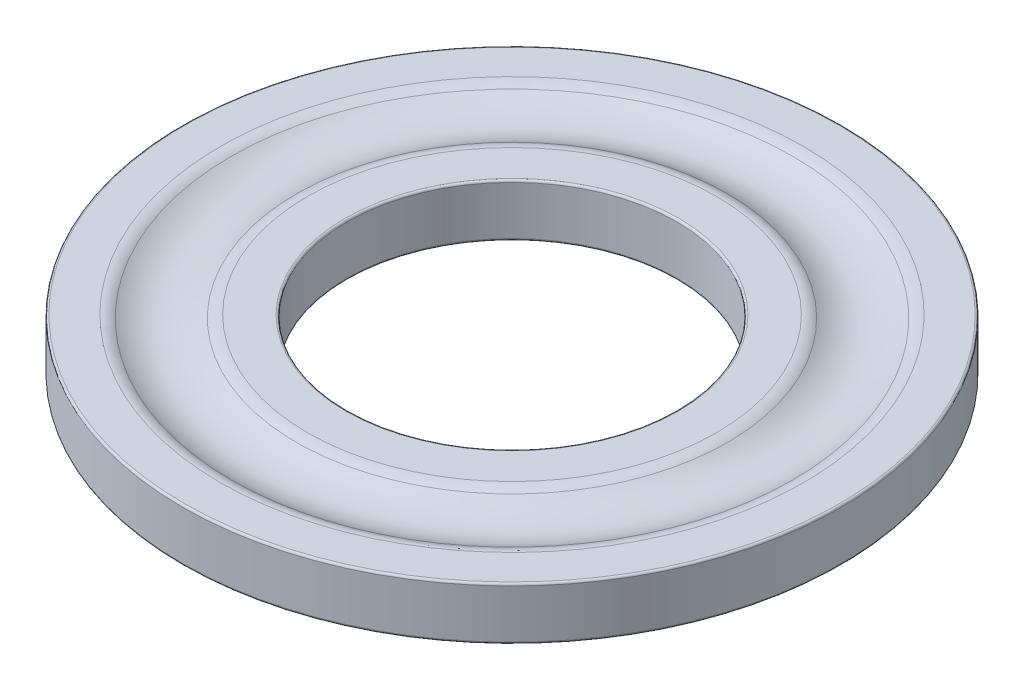
ISO-10303-21;
HEADER;
FILE_DESCRIPTION(('STEP AP214'),'2;1');
FILE_NAME('part.step','',(''),(''),'','','');
FILE_SCHEMA(('AUTOMOTIVE_DESIGN { 1 0 10303 214 1 1 1 1 }'));
ENDSEC;
DATA;
#1=APPLICATION_CONTEXT('core data for automotive mechanical design processes');
#2=APPLICATION_PROTOCOL_DEFINITION('international standard','automotive_design',2000,#1);
#3=PRODUCT_CONTEXT('',#1,'mechanical');
#4=PRODUCT('Part','Part','',(#3));
#5=PRODUCT_RELATED_PRODUCT_CATEGORY('part','',(#4));
#6=PRODUCT_DEFINITION_FORMATION('','',#4);
#7=PRODUCT_DEFINITION_CONTEXT('part definition',#1,'design');
#8=PRODUCT_DEFINITION('design','',#6,#7);
#9=PRODUCT_DEFINITION_SHAPE('','',#8);
#10=(LENGTH_UNIT() NAMED_UNIT(*) SI_UNIT(.MILLI.,.METRE.));
#11=(NAMED_UNIT(*) PLANE_ANGLE_UNIT() SI_UNIT($,.RADIAN.));
#12=(NAMED_UNIT(*) SI_UNIT($,.STERADIAN.) SOLID_ANGLE_UNIT());
#13=UNCERTAINTY_MEASURE_WITH_UNIT(LENGTH_MEASURE(1.E-05),#10,'distance_accuracy_value','');
#14=(GEOMETRIC_REPRESENTATION_CONTEXT(3) GLOBAL_UNCERTAINTY_ASSIGNED_CONTEXT((#13)) GLOBAL_UNIT_ASSIGNED_CONTEXT((#10,
#11,#12)) REPRESENTATION_CONTEXT('',''));
#15=CARTESIAN_POINT('',(0.,0.,0.));
#16=DIRECTION('',(0.,0.,1.));
#17=DIRECTION('',(1.,0.,0.));
#18=AXIS2_PLACEMENT_3D('',#15,#16,#17);
#19=CARTESIAN_POINT('',(0.,2.48,0.));
#20=DIRECTION('',(0.,-1.,0.));
#21=DIRECTION('',(0.,0.,-1.));
#22=AXIS2_PLACEMENT_3D('',#19,#20,#21);
#23=TOROIDAL_SURFACE('',#22,6.02,1.5);
#24=CARTESIAN_POINT('',(0.,1.205,0.));
#25=DIRECTION('',(0.,1.,0.));
#26=DIRECTION('',(0.,0.,1.));
#27=AXIS2_PLACEMENT_3D('',#24,#25,#26);
#28=CIRCLE('',#27,6.81017403146396);
#29=CARTESIAN_POINT('',(0.,1.205,6.81017403146395));
#30=VERTEX_POINT('',#29);
#31=EDGE_CURVE('E74',#30,#30,#28,.F.);
#32=ORIENTED_EDGE('',*,*,#31,.F.);
#33=EDGE_LOOP('',(#32));
#34=FACE_BOUND('',#33,.T.);
#35=CARTESIAN_POINT('',(0.,1.205,0.));
#36=DIRECTION('',(0.,-1.,0.));
#37=DIRECTION('',(0.,0.,-1.));
#38=AXIS2_PLACEMENT_3D('',#35,#36,#37);
#39=CIRCLE('',#38,5.22982596853604);
#40=CARTESIAN_POINT('',(0.,1.205,-5.22982596853604));
#41=VERTEX_POINT('',#40);
#42=EDGE_CURVE('E320',#41,#41,#39,.F.);
#43=ORIENTED_EDGE('',*,*,#42,.F.);
#44=EDGE_LOOP('',(#43));
#45=FACE_BOUND('',#44,.T.);
#46=ADVANCED_FACE('F17',(#34,#45),#23,.F.);
#47=CARTESIAN_POINT('',(0.,0.78,0.));
#48=DIRECTION('',(0.,-1.,0.));
#49=DIRECTION('',(0.,0.,-1.));
#50=AXIS2_PLACEMENT_3D('',#47,#48,#49);
#51=TOROIDAL_SURFACE('',#50,4.96643462471473,0.5);
#52=ORIENTED_EDGE('',*,*,#42,.T.);
#53=EDGE_LOOP('',(#52));
#54=FACE_BOUND('',#53,.T.);
#55=CARTESIAN_POINT('',(0.,1.28,0.));
#56=DIRECTION('',(0.,-1.,0.));
#57=DIRECTION('',(0.,0.,-1.));
#58=AXIS2_PLACEMENT_3D('',#55,#56,#57);
#59=CIRCLE('',#58,4.96643462471473);
#60=CARTESIAN_POINT('',(0.,1.28,4.96643462471473));
#61=VERTEX_POINT('',#60);
#62=CARTESIAN_POINT('',(0.,1.28,-4.96643462471473));
#63=VERTEX_POINT('',#62);
#64=EDGE_CURVE('E66',#61,#63,#59,.F.);
#65=ORIENTED_EDGE('',*,*,#64,.F.);
#66=CARTESIAN_POINT('',(0.,1.28,0.));
#67=DIRECTION('',(0.,-1.,0.));
#68=DIRECTION('',(0.,0.,1.));
#69=AXIS2_PLACEMENT_3D('',#66,#67,#68);
#70=CIRCLE('',#69,4.96643462471473);
#71=EDGE_CURVE('E69',#63,#61,#70,.F.);
#72=ORIENTED_EDGE('',*,*,#71,.F.);
#73=EDGE_LOOP('',(#65,#72));
#74=FACE_BOUND('',#73,.T.);
#75=ADVANCED_FACE('F78',(#54,#74),#51,.T.);
#76=CARTESIAN_POINT('',(0.,0.78,0.));
#77=DIRECTION('',(0.,1.,0.));
#78=DIRECTION('',(0.,0.,1.));
#79=AXIS2_PLACEMENT_3D('',#76,#77,#78);
#80=TOROIDAL_SURFACE('',#79,7.07356537528527,0.5);
#81=ORIENTED_EDGE('',*,*,#31,.T.);
#82=EDGE_LOOP('',(#81));
#83=FACE_BOUND('',#82,.T.);
#84=CARTESIAN_POINT('',(0.,1.28,0.));
#85=DIRECTION('',(0.,1.,0.));
#86=DIRECTION('',(0.,0.,1.));
#87=AXIS2_PLACEMENT_3D('',#84,#85,#86);
#88=CIRCLE('',#87,7.07356537528527);
#89=CARTESIAN_POINT('',(0.,1.28,-7.07356537528527));
#90=VERTEX_POINT('',#89);
#91=CARTESIAN_POINT('',(0.,1.28,7.07356537528527));
#92=VERTEX_POINT('',#91);
#93=EDGE_CURVE('E116',#90,#92,#88,.F.);
#94=ORIENTED_EDGE('',*,*,#93,.F.);
#95=CARTESIAN_POINT('',(0.,1.28,0.));
#96=DIRECTION('',(0.,1.,0.));
#97=DIRECTION('',(0.,0.,-1.));
#98=AXIS2_PLACEMENT_3D('',#95,#96,#97);
#99=CIRCLE('',#98,7.07356537528527);
#100=EDGE_CURVE('E79',#92,#90,#99,.F.);
#101=ORIENTED_EDGE('',*,*,#100,.F.);
#102=EDGE_LOOP('',(#94,#101));
#103=FACE_BOUND('',#102,.T.);
#104=ADVANCED_FACE('F95',(#83,#103),#80,.T.);
#105=CARTESIAN_POINT('',(0.,1.28,0.));
#106=DIRECTION('',(0.,1.,0.));
#107=DIRECTION('',(0.,0.,1.));
#108=AXIS2_PLACEMENT_3D('',#105,#106,#107);
#109=PLANE('',#108);
#110=ORIENTED_EDGE('',*,*,#71,.T.);
#111=ORIENTED_EDGE('',*,*,#64,.T.);
#112=EDGE_LOOP('',(#110,#111));
#113=FACE_BOUND('',#112,.T.);
#114=CARTESIAN_POINT('',(0.,1.28,0.));
#115=DIRECTION('',(0.,1.,0.));
#116=DIRECTION('',(0.,0.,-1.));
#117=AXIS2_PLACEMENT_3D('',#114,#115,#116);
#118=CIRCLE('',#117,4.05);
#119=CARTESIAN_POINT('',(0.,1.28,-4.05));
#120=VERTEX_POINT('',#119);
#121=CARTESIAN_POINT('',(0.,1.28,4.05));
#122=VERTEX_POINT('',#121);
#123=EDGE_CURVE('E127',#120,#122,#118,.T.);
#124=ORIENTED_EDGE('',*,*,#123,.F.);
#125=CARTESIAN_POINT('',(0.,1.28,0.));
#126=DIRECTION('',(0.,1.,0.));
#127=DIRECTION('',(0.,0.,1.));
#128=AXIS2_PLACEMENT_3D('',#125,#126,#127);
#129=CIRCLE('',#128,4.05);
#130=EDGE_CURVE('E128',#122,#120,#129,.T.);
#131=ORIENTED_EDGE('',*,*,#130,.F.);
#132=EDGE_LOOP('',(#124,#131));
#133=FACE_BOUND('',#132,.T.);
#134=ADVANCED_FACE('F71',(#113,#133),#109,.T.);
#135=CARTESIAN_POINT('',(0.,1.28,0.));
#136=DIRECTION('',(0.,1.,0.));
#137=DIRECTION('',(0.,0.,1.));
#138=AXIS2_PLACEMENT_3D('',#135,#136,#137);
#139=PLANE('',#138);
#140=ORIENTED_EDGE('',*,*,#100,.T.);
#141=ORIENTED_EDGE('',*,*,#93,.T.);
#142=EDGE_LOOP('',(#140,#141));
#143=FACE_BOUND('',#142,.T.);
#144=CARTESIAN_POINT('',(0.,1.28,0.));
#145=DIRECTION('',(0.,-1.,0.));
#146=DIRECTION('',(0.,0.,-1.));
#147=AXIS2_PLACEMENT_3D('',#144,#145,#146);
#148=CIRCLE('',#147,7.95);
#149=CARTESIAN_POINT('',(0.,1.28,-7.95));
#150=VERTEX_POINT('',#149);
#151=CARTESIAN_POINT('',(0.,1.28,7.95));
#152=VERTEX_POINT('',#151);
#153=EDGE_CURVE('E198',#150,#152,#148,.T.);
#154=ORIENTED_EDGE('',*,*,#153,.F.);
#155=CARTESIAN_POINT('',(0.,1.28,0.));
#156=DIRECTION('',(0.,-1.,0.));
#157=DIRECTION('',(0.,0.,1.));
#158=AXIS2_PLACEMENT_3D('',#155,#156,#157);
#159=CIRCLE('',#158,7.95);
#160=EDGE_CURVE('E170',#152,#150,#159,.T.);
#161=ORIENTED_EDGE('',*,*,#160,.F.);
#162=EDGE_LOOP('',(#154,#161));
#163=FACE_BOUND('',#162,.T.);
#164=ADVANCED_FACE('F130',(#143,#163),#139,.T.);
#165=CARTESIAN_POINT('',(0.,1.23,0.));
#166=DIRECTION('',(0.,1.,0.));
#167=DIRECTION('',(0.,0.,1.));
#168=AXIS2_PLACEMENT_3D('',#165,#166,#167);
#169=TOROIDAL_SURFACE('',#168,4.05,0.05);
#170=CARTESIAN_POINT('',(0.,1.23,0.));
#171=DIRECTION('',(0.,-1.,0.));
#172=DIRECTION('',(0.,0.,-1.));
#173=AXIS2_PLACEMENT_3D('',#170,#171,#172);
#174=CIRCLE('',#173,4.);
#175=CARTESIAN_POINT('',(0.,1.23,-4.));
#176=VERTEX_POINT('',#175);
#177=EDGE_CURVE('E195',#176,#176,#174,.T.);
#178=ORIENTED_EDGE('',*,*,#177,.T.);
#179=EDGE_LOOP('',(#178));
#180=FACE_BOUND('',#179,.T.);
#181=ORIENTED_EDGE('',*,*,#130,.T.);
#182=ORIENTED_EDGE('',*,*,#123,.T.);
#183=EDGE_LOOP('',(#181,#182));
#184=FACE_BOUND('',#183,.T.);
#185=ADVANCED_FACE('F147',(#180,#184),#169,.T.);
#186=CARTESIAN_POINT('',(0.,1.23,0.));
#187=DIRECTION('',(0.,1.,0.));
#188=DIRECTION('',(0.,0.,1.));
#189=AXIS2_PLACEMENT_3D('',#186,#187,#188);
#190=TOROIDAL_SURFACE('',#189,7.95,0.05);
#191=CARTESIAN_POINT('',(0.,1.23,0.));
#192=DIRECTION('',(0.,-1.,0.));
#193=DIRECTION('',(0.,0.,-1.));
#194=AXIS2_PLACEMENT_3D('',#191,#192,#193);
#195=CIRCLE('',#194,8.);
#196=CARTESIAN_POINT('',(0.,1.23,-8.));
#197=VERTEX_POINT('',#196);
#198=EDGE_CURVE('E193',#197,#197,#195,.T.);
#199=ORIENTED_EDGE('',*,*,#198,.F.);
#200=EDGE_LOOP('',(#199));
#201=FACE_BOUND('',#200,.T.);
#202=ORIENTED_EDGE('',*,*,#160,.T.);
#203=ORIENTED_EDGE('',*,*,#153,.T.);
#204=EDGE_LOOP('',(#202,#203));
#205=FACE_BOUND('',#204,.T.);
#206=ADVANCED_FACE('F176',(#201,#205),#190,.T.);
#207=CARTESIAN_POINT('',(0.,1.28,0.));
#208=DIRECTION('',(0.,-1.,0.));
#209=DIRECTION('',(0.,0.,-1.));
#210=AXIS2_PLACEMENT_3D('',#207,#208,#209);
#211=CYLINDRICAL_SURFACE('',#210,4.);
#212=ORIENTED_EDGE('',*,*,#177,.F.);
#213=EDGE_LOOP('',(#212));
#214=FACE_BOUND('',#213,.T.);
#215=CARTESIAN_POINT('',(0.,0.0499999999999999,0.));
#216=DIRECTION('',(0.,1.,0.));
#217=DIRECTION('',(0.,0.,1.));
#218=AXIS2_PLACEMENT_3D('',#215,#216,#217);
#219=CIRCLE('',#218,4.);
#220=CARTESIAN_POINT('',(0.,0.0499999999999999,4.));
#221=VERTEX_POINT('',#220);
#222=EDGE_CURVE('E414',#221,#221,#219,.T.);
#223=ORIENTED_EDGE('',*,*,#222,.F.);
#224=EDGE_LOOP('',(#223));
#225=FACE_BOUND('',#224,.T.);
#226=ADVANCED_FACE('F186',(#214,#225),#211,.F.);
#227=CARTESIAN_POINT('',(0.,1.28,0.));
#228=DIRECTION('',(0.,-1.,0.));
#229=DIRECTION('',(0.,0.,-1.));
#230=AXIS2_PLACEMENT_3D('',#227,#228,#229);
#231=CYLINDRICAL_SURFACE('',#230,8.);
#232=ORIENTED_EDGE('',*,*,#198,.T.);
#233=EDGE_LOOP('',(#232));
#234=FACE_BOUND('',#233,.T.);
#235=CARTESIAN_POINT('',(0.,0.0499999999999999,0.));
#236=DIRECTION('',(0.,1.,0.));
#237=DIRECTION('',(0.,0.,1.));
#238=AXIS2_PLACEMENT_3D('',#235,#236,#237);
#239=CIRCLE('',#238,8.);
#240=CARTESIAN_POINT('',(0.,0.0499999999999999,8.));
#241=VERTEX_POINT('',#240);
#242=EDGE_CURVE('E412',#241,#241,#239,.F.);
#243=ORIENTED_EDGE('',*,*,#242,.F.);
#244=EDGE_LOOP('',(#243));
#245=FACE_BOUND('',#244,.T.);
#246=ADVANCED_FACE('F269',(#234,#245),#231,.T.);
#247=CARTESIAN_POINT('',(0.,0.0499999999999999,0.));
#248=DIRECTION('',(0.,1.,0.));
#249=DIRECTION('',(0.,0.,1.));
#250=AXIS2_PLACEMENT_3D('',#247,#248,#249);
#251=TOROIDAL_SURFACE('',#250,4.05,0.05);
#252=CARTESIAN_POINT('',(0.,0.,0.));
#253=DIRECTION('',(0.,-1.,0.));
#254=DIRECTION('',(0.,0.,1.));
#255=AXIS2_PLACEMENT_3D('',#252,#253,#254);
#256=CIRCLE('',#255,4.05);
#257=CARTESIAN_POINT('',(0.,0.,4.05));
#258=VERTEX_POINT('',#257);
#259=CARTESIAN_POINT('',(0.,0.,-4.05));
#260=VERTEX_POINT('',#259);
#261=EDGE_CURVE('E310',#258,#260,#256,.T.);
#262=ORIENTED_EDGE('',*,*,#261,.T.);
#263=CARTESIAN_POINT('',(0.,0.,0.));
#264=DIRECTION('',(0.,-1.,0.));
#265=DIRECTION('',(0.,0.,-1.));
#266=AXIS2_PLACEMENT_3D('',#263,#264,#265);
#267=CIRCLE('',#266,4.05);
#268=EDGE_CURVE('E415',#260,#258,#267,.T.);
#269=ORIENTED_EDGE('',*,*,#268,.T.);
#270=EDGE_LOOP('',(#262,#269));
#271=FACE_BOUND('',#270,.T.);
#272=ORIENTED_EDGE('',*,*,#222,.T.);
#273=EDGE_LOOP('',(#272));
#274=FACE_BOUND('',#273,.T.);
#275=ADVANCED_FACE('F216',(#271,#274),#251,.T.);
#276=CARTESIAN_POINT('',(0.,0.0499999999999999,0.));
#277=DIRECTION('',(0.,1.,0.));
#278=DIRECTION('',(0.,0.,1.));
#279=AXIS2_PLACEMENT_3D('',#276,#277,#278);
#280=TOROIDAL_SURFACE('',#279,7.95,0.05);
#281=CARTESIAN_POINT('',(0.,0.,0.));
#282=DIRECTION('',(0.,1.,0.));
#283=DIRECTION('',(0.,0.,1.));
#284=AXIS2_PLACEMENT_3D('',#281,#282,#283);
#285=CIRCLE('',#284,7.95);
#286=CARTESIAN_POINT('',(0.,0.,7.95));
#287=VERTEX_POINT('',#286);
#288=CARTESIAN_POINT('',(0.,0.,-7.95));
#289=VERTEX_POINT('',#288);
#290=EDGE_CURVE('E28',#287,#289,#285,.T.);
#291=ORIENTED_EDGE('',*,*,#290,.T.);
#292=CARTESIAN_POINT('',(0.,0.,0.));
#293=DIRECTION('',(0.,1.,0.));
#294=DIRECTION('',(0.,0.,-1.));
#295=AXIS2_PLACEMENT_3D('',#292,#293,#294);
#296=CIRCLE('',#295,7.95);
#297=EDGE_CURVE('E11',#289,#287,#296,.T.);
#298=ORIENTED_EDGE('',*,*,#297,.T.);
#299=EDGE_LOOP('',(#291,#298));
#300=FACE_BOUND('',#299,.T.);
#301=ORIENTED_EDGE('',*,*,#242,.T.);
#302=EDGE_LOOP('',(#301));
#303=FACE_BOUND('',#302,.T.);
#304=ADVANCED_FACE('F211',(#300,#303),#280,.T.);
#305=CARTESIAN_POINT('',(0.,0.,0.));
#306=DIRECTION('',(0.,1.,0.));
#307=DIRECTION('',(0.,0.,1.));
#308=AXIS2_PLACEMENT_3D('',#305,#306,#307);
#309=PLANE('',#308);
#310=ORIENTED_EDGE('',*,*,#290,.F.);
#311=ORIENTED_EDGE('',*,*,#297,.F.);
#312=EDGE_LOOP('',(#310,#311));
#313=FACE_BOUND('',#312,.T.);
#314=ORIENTED_EDGE('',*,*,#261,.F.);
#315=ORIENTED_EDGE('',*,*,#268,.F.);
#316=EDGE_LOOP('',(#314,#315));
#317=FACE_BOUND('',#316,.T.);
#318=ADVANCED_FACE('F209',(#313,#317),#309,.F.);
#319=CLOSED_SHELL('',(#46,#75,#104,#134,#164,#185,#206,#226,#246,#275,#304,#318));
#320=MANIFOLD_SOLID_BREP('B1',#319);
#321=ADVANCED_BREP_SHAPE_REPRESENTATION('',(#18,#320),#14);
#322=SHAPE_DEFINITION_REPRESENTATION(#9,#321);
ENDSEC;
END-ISO-10303-21;
